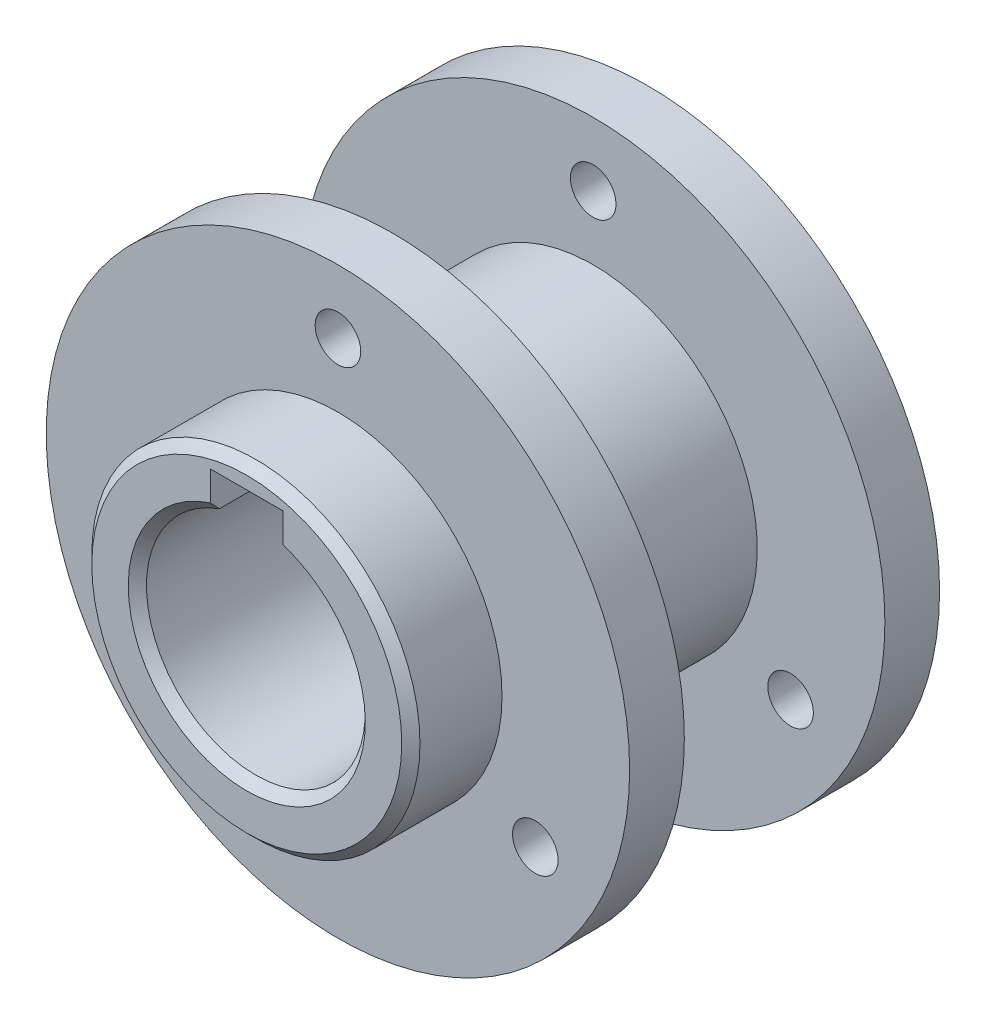
ISO-10303-21;
HEADER;
FILE_DESCRIPTION(('STEP AP214'),'2;1');
FILE_NAME('part.step','',(''),(''),'','','');
FILE_SCHEMA(('AUTOMOTIVE_DESIGN { 1 0 10303 214 1 1 1 1 }'));
ENDSEC;
DATA;
#1=APPLICATION_CONTEXT('core data for automotive mechanical design processes');
#2=APPLICATION_PROTOCOL_DEFINITION('international standard','automotive_design',2000,#1);
#3=PRODUCT_CONTEXT('',#1,'mechanical');
#4=PRODUCT('Part','Part','',(#3));
#5=PRODUCT_RELATED_PRODUCT_CATEGORY('part','',(#4));
#6=PRODUCT_DEFINITION_FORMATION('','',#4);
#7=PRODUCT_DEFINITION_CONTEXT('part definition',#1,'design');
#8=PRODUCT_DEFINITION('design','',#6,#7);
#9=PRODUCT_DEFINITION_SHAPE('','',#8);
#10=(LENGTH_UNIT() NAMED_UNIT(*) SI_UNIT(.MILLI.,.METRE.));
#11=(NAMED_UNIT(*) PLANE_ANGLE_UNIT() SI_UNIT($,.RADIAN.));
#12=(NAMED_UNIT(*) SI_UNIT($,.STERADIAN.) SOLID_ANGLE_UNIT());
#13=UNCERTAINTY_MEASURE_WITH_UNIT(LENGTH_MEASURE(1.E-05),#10,'distance_accuracy_value','');
#14=(GEOMETRIC_REPRESENTATION_CONTEXT(3) GLOBAL_UNCERTAINTY_ASSIGNED_CONTEXT((#13)) GLOBAL_UNIT_ASSIGNED_CONTEXT((#10,
#11,#12)) REPRESENTATION_CONTEXT('',''));
#15=CARTESIAN_POINT('',(0.,0.,0.));
#16=DIRECTION('',(0.,0.,1.));
#17=DIRECTION('',(1.,0.,0.));
#18=AXIS2_PLACEMENT_3D('',#15,#16,#17);
#19=CARTESIAN_POINT('',(0.,0.,-26.9999999999868));
#20=DIRECTION('',(0.,0.,-1.));
#21=DIRECTION('',(-1.,0.,0.));
#22=AXIS2_PLACEMENT_3D('',#19,#20,#21);
#23=CONICAL_SURFACE('',#22,6.50000000001683,0.785398163340605);
#24=CARTESIAN_POINT('',(0.,0.,-26.5));
#25=DIRECTION('',(0.,0.,1.));
#26=DIRECTION('',(1.,0.,0.));
#27=AXIS2_PLACEMENT_3D('',#24,#25,#26);
#28=CIRCLE('',#27,6.);
#29=CARTESIAN_POINT('',(-2.,5.65685424951406,-26.499999999977));
#30=VERTEX_POINT('',#29);
#31=CARTESIAN_POINT('',(2.,5.65685424951222,-26.4999999999753));
#32=VERTEX_POINT('',#31);
#33=EDGE_CURVE('E109',#30,#32,#28,.T.);
#34=ORIENTED_EDGE('',*,*,#33,.T.);
#35=CARTESIAN_POINT('',(2.,5.65685424953206,-26.4999999999506));
#36=CARTESIAN_POINT('',(2.,5.74501185585493,-26.5831325219464));
#37=CARTESIAN_POINT('',(2.,5.83307434371292,-26.6663654517907));
#38=CARTESIAN_POINT('',(2.,6.00900907332968,-26.8330321184897));
#39=CARTESIAN_POINT('',(2.,6.09688131510829,-26.9164658553234));
#40=CARTESIAN_POINT('',(2.,6.18465843844184,-26.9999999999846));
#41=B_SPLINE_CURVE_WITH_KNOTS('',3,(#35,#36,#37,#38,#39,#40),.UNSPECIFIED.,.F.,.F.,(4,2,4),(0.,
0.363516851609109,0.727033665326372),.UNSPECIFIED.);
#42=CARTESIAN_POINT('',(2.,6.18465843844301,-26.9999999999857));
#43=VERTEX_POINT('',#42);
#44=EDGE_CURVE('E197',#32,#43,#41,.T.);
#45=ORIENTED_EDGE('',*,*,#44,.T.);
#46=CARTESIAN_POINT('',(0.,0.,-26.9999999999868));
#47=DIRECTION('',(0.,0.,-1.));
#48=DIRECTION('',(-1.,0.,0.));
#49=AXIS2_PLACEMENT_3D('',#46,#47,#48);
#50=CIRCLE('',#49,6.50000000001683);
#51=CARTESIAN_POINT('',(-2.,6.18465843844301,-26.9999999999857));
#52=VERTEX_POINT('',#51);
#53=EDGE_CURVE('E94',#43,#52,#50,.T.);
#54=ORIENTED_EDGE('',*,*,#53,.T.);
#55=CARTESIAN_POINT('',(-2.,6.18465843844184,-26.9999999999846));
#56=CARTESIAN_POINT('',(-2.,6.0968813151089,-26.916465855324));
#57=CARTESIAN_POINT('',(-2.,6.0090090733309,-26.8330321184908));
#58=CARTESIAN_POINT('',(-2.,5.83307434371536,-26.666365451793));
#59=CARTESIAN_POINT('',(-2.,5.74501185585799,-26.5831325219493));
#60=CARTESIAN_POINT('',(-2.,5.65685424953574,-26.499999999954));
#61=B_SPLINE_CURVE_WITH_KNOTS('',3,(#55,#56,#57,#58,#59,#60),.UNSPECIFIED.,.F.,.F.,(4,2,4),(0.,
0.363516813714742,0.727033665321328),.UNSPECIFIED.);
#62=EDGE_CURVE('E91',#52,#30,#61,.T.);
#63=ORIENTED_EDGE('',*,*,#62,.T.);
#64=EDGE_LOOP('',(#34,#45,#54,#63));
#65=FACE_BOUND('',#64,.T.);
#66=ADVANCED_FACE('F17',(#65),#23,.F.);
#67=CARTESIAN_POINT('',(-2.,4.2,0.));
#68=DIRECTION('',(-1.,0.,0.));
#69=DIRECTION('',(0.,0.,1.));
#70=AXIS2_PLACEMENT_3D('',#67,#68,#69);
#71=PLANE('',#70);
#72=ORIENTED_EDGE('',*,*,#62,.F.);
#73=DIRECTION('',(0.,1.,0.));
#74=VECTOR('',#73,1.);
#75=CARTESIAN_POINT('',(-2.,6.,-27.));
#76=LINE('',#75,#74);
#77=CARTESIAN_POINT('',(-2.,7.8,-27.));
#78=VERTEX_POINT('',#77);
#79=EDGE_CURVE('E83',#52,#78,#76,.T.);
#80=ORIENTED_EDGE('',*,*,#79,.T.);
#81=DIRECTION('',(0.,0.,1.));
#82=VECTOR('',#81,1.);
#83=CARTESIAN_POINT('',(-2.,7.8,0.));
#84=LINE('',#83,#82);
#85=CARTESIAN_POINT('',(-2.,7.8,0.));
#86=VERTEX_POINT('',#85);
#87=EDGE_CURVE('E87',#78,#86,#84,.T.);
#88=ORIENTED_EDGE('',*,*,#87,.T.);
#89=DIRECTION('',(0.,1.,0.));
#90=VECTOR('',#89,1.);
#91=CARTESIAN_POINT('',(-2.,4.2,0.));
#92=LINE('',#91,#90);
#93=CARTESIAN_POINT('',(-2.,6.18465843838212,5.46408833096245E-11));
#94=VERTEX_POINT('',#93);
#95=EDGE_CURVE('E40',#94,#86,#92,.T.);
#96=ORIENTED_EDGE('',*,*,#95,.F.);
#97=CARTESIAN_POINT('',(-2.,5.65685424945765,-0.49999999993588));
#98=CARTESIAN_POINT('',(-2.,5.74501185578258,-0.416867477947635));
#99=CARTESIAN_POINT('',(-2.,5.83307434364262,-0.333634548110986));
#100=CARTESIAN_POINT('',(-2.,6.0090090732635,-0.166967881427282));
#101=CARTESIAN_POINT('',(-2.,6.09688131504418,-0.0835341446011579));
#102=CARTESIAN_POINT('',(-2.,6.1846584383798,5.24380888034014E-11));
#103=B_SPLINE_CURVE_WITH_KNOTS('',3,(#97,#98,#99,#100,#101,#102),.UNSPECIFIED.,.F.,.F.,(4,2,4),
(0.,0.363516851597878,0.727033665303914),.UNSPECIFIED.);
#104=CARTESIAN_POINT('',(-2.,5.65685424947502,-0.499999999933606));
#105=VERTEX_POINT('',#104);
#106=EDGE_CURVE('E21',#105,#94,#103,.T.);
#107=ORIENTED_EDGE('',*,*,#106,.F.);
#108=DIRECTION('',(0.,0.,1.));
#109=VECTOR('',#108,1.);
#110=CARTESIAN_POINT('',(-2.,5.65685424949238,17.5398064383656));
#111=LINE('',#110,#109);
#112=EDGE_CURVE('E93',#105,#30,#111,.F.);
#113=ORIENTED_EDGE('',*,*,#112,.T.);
#114=EDGE_LOOP('',(#72,#80,#88,#96,#107,#113));
#115=FACE_BOUND('',#114,.T.);
#116=ADVANCED_FACE('F85',(#115),#71,.F.);
#117=CARTESIAN_POINT('',(2.,4.2,0.));
#118=DIRECTION('',(1.,0.,0.));
#119=DIRECTION('',(0.,0.,-1.));
#120=AXIS2_PLACEMENT_3D('',#117,#118,#119);
#121=PLANE('',#120);
#122=ORIENTED_EDGE('',*,*,#44,.F.);
#123=DIRECTION('',(0.,0.,1.));
#124=VECTOR('',#123,1.);
#125=CARTESIAN_POINT('',(2.,5.65685424949238,17.5398064383656));
#126=LINE('',#125,#124);
#127=CARTESIAN_POINT('',(2.,5.65685424947307,-0.499999999935438));
#128=VERTEX_POINT('',#127);
#129=EDGE_CURVE('E118',#32,#128,#126,.T.);
#130=ORIENTED_EDGE('',*,*,#129,.T.);
#131=CARTESIAN_POINT('',(2.,6.1846584383798,5.24390346599409E-11));
#132=CARTESIAN_POINT('',(2.,6.09688131504354,-0.0835341446017711));
#133=CARTESIAN_POINT('',(2.,6.00900907326221,-0.166967881428507));
#134=CARTESIAN_POINT('',(2.,5.83307434364003,-0.333634548113434));
#135=CARTESIAN_POINT('',(2.,5.74501185577934,-0.416867477950692));
#136=CARTESIAN_POINT('',(2.,5.65685424945377,-0.499999999939543));
#137=B_SPLINE_CURVE_WITH_KNOTS('',3,(#131,#132,#133,#134,#135,#136),.UNSPECIFIED.,.F.,.F.,(4,2,
4),(0.,0.363516813708706,0.727033665309256),.UNSPECIFIED.);
#138=CARTESIAN_POINT('',(2.,6.18465843835456,2.8421709430404E-11));
#139=VERTEX_POINT('',#138);
#140=EDGE_CURVE('E123',#139,#128,#137,.T.);
#141=ORIENTED_EDGE('',*,*,#140,.F.);
#142=DIRECTION('',(0.,1.,0.));
#143=VECTOR('',#142,1.);
#144=CARTESIAN_POINT('',(2.,4.2,0.));
#145=LINE('',#144,#143);
#146=CARTESIAN_POINT('',(2.,7.8,0.));
#147=VERTEX_POINT('',#146);
#148=EDGE_CURVE('E121',#147,#139,#145,.F.);
#149=ORIENTED_EDGE('',*,*,#148,.F.);
#150=DIRECTION('',(0.,0.,1.));
#151=VECTOR('',#150,1.);
#152=CARTESIAN_POINT('',(2.,7.8,0.));
#153=LINE('',#152,#151);
#154=CARTESIAN_POINT('',(2.,7.8,-27.));
#155=VERTEX_POINT('',#154);
#156=EDGE_CURVE('E76',#147,#155,#153,.F.);
#157=ORIENTED_EDGE('',*,*,#156,.T.);
#158=DIRECTION('',(0.,1.,0.));
#159=VECTOR('',#158,1.);
#160=CARTESIAN_POINT('',(2.,6.,-27.));
#161=LINE('',#160,#159);
#162=EDGE_CURVE('E100',#155,#43,#161,.F.);
#163=ORIENTED_EDGE('',*,*,#162,.T.);
#164=EDGE_LOOP('',(#122,#130,#141,#149,#157,#163));
#165=FACE_BOUND('',#164,.T.);
#166=ADVANCED_FACE('F207',(#165),#121,.F.);
#167=CARTESIAN_POINT('',(0.,6.,-27.));
#168=DIRECTION('',(0.,0.,1.));
#169=DIRECTION('',(1.,0.,0.));
#170=AXIS2_PLACEMENT_3D('',#167,#168,#169);
#171=PLANE('',#170);
#172=ORIENTED_EDGE('',*,*,#53,.F.);
#173=ORIENTED_EDGE('',*,*,#162,.F.);
#174=DIRECTION('',(1.,0.,0.));
#175=VECTOR('',#174,1.);
#176=CARTESIAN_POINT('',(2.,7.8,-27.));
#177=LINE('',#176,#175);
#178=EDGE_CURVE('E97',#155,#78,#177,.F.);
#179=ORIENTED_EDGE('',*,*,#178,.T.);
#180=ORIENTED_EDGE('',*,*,#79,.F.);
#181=EDGE_LOOP('',(#172,#173,#179,#180));
#182=FACE_BOUND('',#181,.T.);
#183=CARTESIAN_POINT('',(0.,0.,-27.));
#184=DIRECTION('',(0.,0.,1.));
#185=DIRECTION('',(1.,0.,0.));
#186=AXIS2_PLACEMENT_3D('',#183,#184,#185);
#187=CIRCLE('',#186,8.5);
#188=CARTESIAN_POINT('',(8.5,0.,-27.));
#189=VERTEX_POINT('',#188);
#190=EDGE_CURVE('E105',#189,#189,#187,.T.);
#191=ORIENTED_EDGE('',*,*,#190,.F.);
#192=EDGE_LOOP('',(#191));
#193=FACE_BOUND('',#192,.T.);
#194=ADVANCED_FACE('F98',(#182,#193),#171,.F.);
#195=CARTESIAN_POINT('',(0.,0.,17.5398064383656));
#196=DIRECTION('',(0.,0.,1.));
#197=DIRECTION('',(1.,0.,0.));
#198=AXIS2_PLACEMENT_3D('',#195,#196,#197);
#199=CYLINDRICAL_SURFACE('',#198,6.);
#200=ORIENTED_EDGE('',*,*,#33,.F.);
#201=ORIENTED_EDGE('',*,*,#112,.F.);
#202=CARTESIAN_POINT('',(0.,0.,-0.499999999931333));
#203=DIRECTION('',(0.,0.,1.));
#204=DIRECTION('',(1.,0.,0.));
#205=AXIS2_PLACEMENT_3D('',#202,#203,#204);
#206=CIRCLE('',#205,5.99999999997181);
#207=EDGE_CURVE('E70',#105,#128,#206,.T.);
#208=ORIENTED_EDGE('',*,*,#207,.T.);
#209=ORIENTED_EDGE('',*,*,#129,.F.);
#210=EDGE_LOOP('',(#200,#201,#208,#209));
#211=FACE_BOUND('',#210,.T.);
#212=ADVANCED_FACE('F237',(#211),#199,.F.);
#213=CARTESIAN_POINT('',(0.,0.,-26.5));
#214=DIRECTION('',(0.,0.,1.));
#215=DIRECTION('',(1.,0.,0.));
#216=AXIS2_PLACEMENT_3D('',#213,#214,#215);
#217=CONICAL_SURFACE('',#216,9.,0.78539816339745);
#218=CARTESIAN_POINT('',(0.,0.,-26.5));
#219=DIRECTION('',(0.,0.,1.));
#220=DIRECTION('',(1.,0.,0.));
#221=AXIS2_PLACEMENT_3D('',#218,#219,#220);
#222=CIRCLE('',#221,9.);
#223=CARTESIAN_POINT('',(9.,0.,-26.5));
#224=VERTEX_POINT('',#223);
#225=EDGE_CURVE('E128',#224,#224,#222,.T.);
#226=ORIENTED_EDGE('',*,*,#225,.F.);
#227=EDGE_LOOP('',(#226));
#228=FACE_BOUND('',#227,.T.);
#229=ORIENTED_EDGE('',*,*,#190,.T.);
#230=EDGE_LOOP('',(#229));
#231=FACE_BOUND('',#230,.T.);
#232=ADVANCED_FACE('F454',(#228,#231),#217,.T.);
#233=CARTESIAN_POINT('',(2.,7.8,0.));
#234=DIRECTION('',(0.,1.,0.));
#235=DIRECTION('',(0.,0.,1.));
#236=AXIS2_PLACEMENT_3D('',#233,#234,#235);
#237=PLANE('',#236);
#238=ORIENTED_EDGE('',*,*,#156,.F.);
#239=DIRECTION('',(-1.,0.,0.));
#240=VECTOR('',#239,1.);
#241=CARTESIAN_POINT('',(0.,7.8,0.));
#242=LINE('',#241,#240);
#243=EDGE_CURVE('E104',#147,#86,#242,.T.);
#244=ORIENTED_EDGE('',*,*,#243,.T.);
#245=ORIENTED_EDGE('',*,*,#87,.F.);
#246=ORIENTED_EDGE('',*,*,#178,.F.);
#247=EDGE_LOOP('',(#238,#244,#245,#246));
#248=FACE_BOUND('',#247,.T.);
#249=ADVANCED_FACE('F103',(#248),#237,.F.);
#250=CARTESIAN_POINT('',(0.,0.,5.6843418860808E-11));
#251=DIRECTION('',(0.,0.,1.));
#252=DIRECTION('',(1.,0.,0.));
#253=AXIS2_PLACEMENT_3D('',#250,#251,#252);
#254=CONICAL_SURFACE('',#253,6.49999999995998,0.785398163397448);
#255=ORIENTED_EDGE('',*,*,#207,.F.);
#256=ORIENTED_EDGE('',*,*,#106,.T.);
#257=CARTESIAN_POINT('',(0.,0.,5.6843418860808E-11));
#258=DIRECTION('',(0.,0.,1.));
#259=DIRECTION('',(1.,0.,0.));
#260=AXIS2_PLACEMENT_3D('',#257,#258,#259);
#261=CIRCLE('',#260,6.49999999995998);
#262=EDGE_CURVE('E127',#94,#139,#261,.T.);
#263=ORIENTED_EDGE('',*,*,#262,.T.);
#264=ORIENTED_EDGE('',*,*,#140,.T.);
#265=EDGE_LOOP('',(#255,#256,#263,#264));
#266=FACE_BOUND('',#265,.T.);
#267=ADVANCED_FACE('F266',(#266),#254,.F.);
#268=CARTESIAN_POINT('',(0.,0.,17.5398064383656));
#269=DIRECTION('',(0.,0.,1.));
#270=DIRECTION('',(1.,0.,0.));
#271=AXIS2_PLACEMENT_3D('',#268,#269,#270);
#272=CYLINDRICAL_SURFACE('',#271,9.);
#273=CARTESIAN_POINT('',(0.,0.,-22.));
#274=DIRECTION('',(0.,0.,1.));
#275=DIRECTION('',(1.,0.,0.));
#276=AXIS2_PLACEMENT_3D('',#273,#274,#275);
#277=CIRCLE('',#276,9.);
#278=CARTESIAN_POINT('',(9.,0.,-22.));
#279=VERTEX_POINT('',#278);
#280=EDGE_CURVE('E191',#279,#279,#277,.F.);
#281=ORIENTED_EDGE('',*,*,#280,.T.);
#282=EDGE_LOOP('',(#281));
#283=FACE_BOUND('',#282,.T.);
#284=ORIENTED_EDGE('',*,*,#225,.T.);
#285=EDGE_LOOP('',(#284));
#286=FACE_BOUND('',#285,.T.);
#287=ADVANCED_FACE('F257',(#283,#286),#272,.T.);
#288=CARTESIAN_POINT('',(0.,9.,0.));
#289=DIRECTION('',(0.,0.,-1.));
#290=DIRECTION('',(-1.,0.,0.));
#291=AXIS2_PLACEMENT_3D('',#288,#289,#290);
#292=PLANE('',#291);
#293=ORIENTED_EDGE('',*,*,#262,.F.);
#294=ORIENTED_EDGE('',*,*,#95,.T.);
#295=ORIENTED_EDGE('',*,*,#243,.F.);
#296=ORIENTED_EDGE('',*,*,#148,.T.);
#297=EDGE_LOOP('',(#293,#294,#295,#296));
#298=FACE_BOUND('',#297,.T.);
#299=CARTESIAN_POINT('',(0.,0.,0.));
#300=DIRECTION('',(0.,0.,-1.));
#301=DIRECTION('',(-1.,0.,0.));
#302=AXIS2_PLACEMENT_3D('',#299,#300,#301);
#303=CIRCLE('',#302,8.50000000000001);
#304=CARTESIAN_POINT('',(-8.50000000000001,0.,0.));
#305=VERTEX_POINT('',#304);
#306=EDGE_CURVE('E188',#305,#305,#303,.T.);
#307=ORIENTED_EDGE('',*,*,#306,.F.);
#308=EDGE_LOOP('',(#307));
#309=FACE_BOUND('',#308,.T.);
#310=ADVANCED_FACE('F255',(#298,#309),#292,.F.);
#311=CARTESIAN_POINT('',(0.,9.,-22.));
#312=DIRECTION('',(0.,0.,1.));
#313=DIRECTION('',(1.,0.,0.));
#314=AXIS2_PLACEMENT_3D('',#311,#312,#313);
#315=PLANE('',#314);
#316=CARTESIAN_POINT('',(-10.8253175473055,-6.25000000000005,-22.));
#317=DIRECTION('',(0.,0.,-1.));
#318=DIRECTION('',(-1.,0.,0.));
#319=AXIS2_PLACEMENT_3D('',#316,#317,#318);
#320=CIRCLE('',#319,1.25);
#321=CARTESIAN_POINT('',(-12.0753175473055,-6.25000000000005,-22.));
#322=VERTEX_POINT('',#321);
#323=EDGE_CURVE('E179',#322,#322,#320,.F.);
#324=ORIENTED_EDGE('',*,*,#323,.T.);
#325=EDGE_LOOP('',(#324));
#326=FACE_BOUND('',#325,.T.);
#327=CARTESIAN_POINT('',(0.,12.5,-22.));
#328=DIRECTION('',(0.,0.,-1.));
#329=DIRECTION('',(-1.,0.,0.));
#330=AXIS2_PLACEMENT_3D('',#327,#328,#329);
#331=CIRCLE('',#330,1.25);
#332=CARTESIAN_POINT('',(-1.25,12.5,-22.));
#333=VERTEX_POINT('',#332);
#334=EDGE_CURVE('E182',#333,#333,#331,.F.);
#335=ORIENTED_EDGE('',*,*,#334,.T.);
#336=EDGE_LOOP('',(#335));
#337=FACE_BOUND('',#336,.T.);
#338=ORIENTED_EDGE('',*,*,#280,.F.);
#339=EDGE_LOOP('',(#338));
#340=FACE_BOUND('',#339,.T.);
#341=CARTESIAN_POINT('',(10.8253175473055,-6.2499999999999,-22.));
#342=DIRECTION('',(0.,0.,-1.));
#343=DIRECTION('',(-1.,0.,0.));
#344=AXIS2_PLACEMENT_3D('',#341,#342,#343);
#345=CIRCLE('',#344,1.25);
#346=CARTESIAN_POINT('',(9.57531754730555,-6.2499999999999,-22.));
#347=VERTEX_POINT('',#346);
#348=EDGE_CURVE('E176',#347,#347,#345,.F.);
#349=ORIENTED_EDGE('',*,*,#348,.T.);
#350=EDGE_LOOP('',(#349));
#351=FACE_BOUND('',#350,.T.);
#352=CARTESIAN_POINT('',(0.,0.,-22.));
#353=DIRECTION('',(0.,0.,1.));
#354=DIRECTION('',(1.,0.,0.));
#355=AXIS2_PLACEMENT_3D('',#352,#353,#354);
#356=CIRCLE('',#355,16.);
#357=CARTESIAN_POINT('',(16.,0.,-22.));
#358=VERTEX_POINT('',#357);
#359=EDGE_CURVE('E185',#358,#358,#356,.T.);
#360=ORIENTED_EDGE('',*,*,#359,.F.);
#361=EDGE_LOOP('',(#360));
#362=FACE_BOUND('',#361,.T.);
#363=ADVANCED_FACE('F251',(#326,#337,#340,#351,#362),#315,.F.);
#364=CARTESIAN_POINT('',(0.,0.,-0.499999999999992));
#365=DIRECTION('',(0.,0.,-1.));
#366=DIRECTION('',(-1.,0.,0.));
#367=AXIS2_PLACEMENT_3D('',#364,#365,#366);
#368=CONICAL_SURFACE('',#367,9.,0.785398163397445);
#369=CARTESIAN_POINT('',(0.,0.,-0.49999999999999));
#370=DIRECTION('',(0.,0.,1.));
#371=DIRECTION('',(1.,0.,0.));
#372=AXIS2_PLACEMENT_3D('',#369,#370,#371);
#373=CIRCLE('',#372,9.);
#374=CARTESIAN_POINT('',(9.,0.,-0.49999999999999));
#375=VERTEX_POINT('',#374);
#376=EDGE_CURVE('E175',#375,#375,#373,.F.);
#377=ORIENTED_EDGE('',*,*,#376,.F.);
#378=EDGE_LOOP('',(#377));
#379=FACE_BOUND('',#378,.T.);
#380=ORIENTED_EDGE('',*,*,#306,.T.);
#381=EDGE_LOOP('',(#380));
#382=FACE_BOUND('',#381,.T.);
#383=ADVANCED_FACE('F247',(#379,#382),#368,.T.);
#384=CARTESIAN_POINT('',(0.,0.,17.5398064383656));
#385=DIRECTION('',(0.,0.,1.));
#386=DIRECTION('',(1.,0.,0.));
#387=AXIS2_PLACEMENT_3D('',#384,#385,#386);
#388=CYLINDRICAL_SURFACE('',#387,16.);
#389=ORIENTED_EDGE('',*,*,#359,.T.);
#390=EDGE_LOOP('',(#389));
#391=FACE_BOUND('',#390,.T.);
#392=CARTESIAN_POINT('',(0.,0.,-19.));
#393=DIRECTION('',(0.,0.,1.));
#394=DIRECTION('',(1.,0.,0.));
#395=AXIS2_PLACEMENT_3D('',#392,#393,#394);
#396=CIRCLE('',#395,16.);
#397=CARTESIAN_POINT('',(16.,0.,-19.));
#398=VERTEX_POINT('',#397);
#399=EDGE_CURVE('E172',#398,#398,#396,.T.);
#400=ORIENTED_EDGE('',*,*,#399,.F.);
#401=EDGE_LOOP('',(#400));
#402=FACE_BOUND('',#401,.T.);
#403=ADVANCED_FACE('F250',(#391,#402),#388,.T.);
#404=CARTESIAN_POINT('',(0.,12.5,-22.));
#405=DIRECTION('',(0.,0.,-1.));
#406=DIRECTION('',(-1.,0.,0.));
#407=AXIS2_PLACEMENT_3D('',#404,#405,#406);
#408=CYLINDRICAL_SURFACE('',#407,1.25);
#409=ORIENTED_EDGE('',*,*,#334,.F.);
#410=EDGE_LOOP('',(#409));
#411=FACE_BOUND('',#410,.T.);
#412=CARTESIAN_POINT('',(0.,12.5,-19.));
#413=DIRECTION('',(0.,0.,-1.));
#414=DIRECTION('',(-1.,0.,0.));
#415=AXIS2_PLACEMENT_3D('',#412,#413,#414);
#416=CIRCLE('',#415,1.25);
#417=CARTESIAN_POINT('',(-1.25,12.5,-19.));
#418=VERTEX_POINT('',#417);
#419=EDGE_CURVE('E169',#418,#418,#416,.T.);
#420=ORIENTED_EDGE('',*,*,#419,.F.);
#421=EDGE_LOOP('',(#420));
#422=FACE_BOUND('',#421,.T.);
#423=ADVANCED_FACE('F314',(#411,#422),#408,.F.);
#424=CARTESIAN_POINT('',(-10.8253175473055,-6.25000000000005,-22.));
#425=DIRECTION('',(0.,0.,-1.));
#426=DIRECTION('',(-1.,0.,0.));
#427=AXIS2_PLACEMENT_3D('',#424,#425,#426);
#428=CYLINDRICAL_SURFACE('',#427,1.25);
#429=ORIENTED_EDGE('',*,*,#323,.F.);
#430=EDGE_LOOP('',(#429));
#431=FACE_BOUND('',#430,.T.);
#432=CARTESIAN_POINT('',(-10.8253175473055,-6.25000000000005,-19.));
#433=DIRECTION('',(0.,0.,-1.));
#434=DIRECTION('',(-1.,0.,0.));
#435=AXIS2_PLACEMENT_3D('',#432,#433,#434);
#436=CIRCLE('',#435,1.25);
#437=CARTESIAN_POINT('',(-12.0753175473055,-6.25000000000005,-19.));
#438=VERTEX_POINT('',#437);
#439=EDGE_CURVE('E166',#438,#438,#436,.T.);
#440=ORIENTED_EDGE('',*,*,#439,.F.);
#441=EDGE_LOOP('',(#440));
#442=FACE_BOUND('',#441,.T.);
#443=ADVANCED_FACE('F310',(#431,#442),#428,.F.);
#444=CARTESIAN_POINT('',(10.8253175473055,-6.2499999999999,-22.));
#445=DIRECTION('',(0.,0.,-1.));
#446=DIRECTION('',(-1.,0.,0.));
#447=AXIS2_PLACEMENT_3D('',#444,#445,#446);
#448=CYLINDRICAL_SURFACE('',#447,1.25);
#449=ORIENTED_EDGE('',*,*,#348,.F.);
#450=EDGE_LOOP('',(#449));
#451=FACE_BOUND('',#450,.T.);
#452=CARTESIAN_POINT('',(10.8253175473055,-6.2499999999999,-19.));
#453=DIRECTION('',(0.,0.,-1.));
#454=DIRECTION('',(-1.,0.,0.));
#455=AXIS2_PLACEMENT_3D('',#452,#453,#454);
#456=CIRCLE('',#455,1.25);
#457=CARTESIAN_POINT('',(9.57531754730555,-6.2499999999999,-19.));
#458=VERTEX_POINT('',#457);
#459=EDGE_CURVE('E163',#458,#458,#456,.T.);
#460=ORIENTED_EDGE('',*,*,#459,.F.);
#461=EDGE_LOOP('',(#460));
#462=FACE_BOUND('',#461,.T.);
#463=ADVANCED_FACE('F307',(#451,#462),#448,.F.);
#464=CARTESIAN_POINT('',(0.,0.,17.5398064383656));
#465=DIRECTION('',(0.,0.,1.));
#466=DIRECTION('',(1.,0.,0.));
#467=AXIS2_PLACEMENT_3D('',#464,#465,#466);
#468=CYLINDRICAL_SURFACE('',#467,9.);
#469=ORIENTED_EDGE('',*,*,#376,.T.);
#470=EDGE_LOOP('',(#469));
#471=FACE_BOUND('',#470,.T.);
#472=CARTESIAN_POINT('',(0.,0.,-5.));
#473=DIRECTION('',(0.,0.,1.));
#474=DIRECTION('',(1.,0.,0.));
#475=AXIS2_PLACEMENT_3D('',#472,#473,#474);
#476=CIRCLE('',#475,9.);
#477=CARTESIAN_POINT('',(9.,0.,-5.));
#478=VERTEX_POINT('',#477);
#479=EDGE_CURVE('E160',#478,#478,#476,.T.);
#480=ORIENTED_EDGE('',*,*,#479,.T.);
#481=EDGE_LOOP('',(#480));
#482=FACE_BOUND('',#481,.T.);
#483=ADVANCED_FACE('F244',(#471,#482),#468,.T.);
#484=CARTESIAN_POINT('',(9.,0.,-19.));
#485=DIRECTION('',(0.,0.,1.));
#486=DIRECTION('',(1.,0.,0.));
#487=AXIS2_PLACEMENT_3D('',#484,#485,#486);
#488=PLANE('',#487);
#489=ORIENTED_EDGE('',*,*,#459,.T.);
#490=EDGE_LOOP('',(#489));
#491=FACE_BOUND('',#490,.T.);
#492=ORIENTED_EDGE('',*,*,#439,.T.);
#493=EDGE_LOOP('',(#492));
#494=FACE_BOUND('',#493,.T.);
#495=ORIENTED_EDGE('',*,*,#419,.T.);
#496=EDGE_LOOP('',(#495));
#497=FACE_BOUND('',#496,.T.);
#498=CARTESIAN_POINT('',(0.,0.,-19.));
#499=DIRECTION('',(0.,0.,-1.));
#500=DIRECTION('',(-1.,0.,0.));
#501=AXIS2_PLACEMENT_3D('',#498,#499,#500);
#502=CIRCLE('',#501,9.);
#503=CARTESIAN_POINT('',(-9.,0.,-19.));
#504=VERTEX_POINT('',#503);
#505=EDGE_CURVE('E157',#504,#504,#502,.F.);
#506=ORIENTED_EDGE('',*,*,#505,.F.);
#507=EDGE_LOOP('',(#506));
#508=FACE_BOUND('',#507,.T.);
#509=ORIENTED_EDGE('',*,*,#399,.T.);
#510=EDGE_LOOP('',(#509));
#511=FACE_BOUND('',#510,.T.);
#512=ADVANCED_FACE('F300',(#491,#494,#497,#508,#511),#488,.T.);
#513=CARTESIAN_POINT('',(0.,16.,-5.));
#514=DIRECTION('',(0.,0.,-1.));
#515=DIRECTION('',(-1.,0.,0.));
#516=AXIS2_PLACEMENT_3D('',#513,#514,#515);
#517=PLANE('',#516);
#518=CARTESIAN_POINT('',(0.,12.5,-5.));
#519=DIRECTION('',(0.,0.,-1.));
#520=DIRECTION('',(-1.,0.,0.));
#521=AXIS2_PLACEMENT_3D('',#518,#519,#520);
#522=CIRCLE('',#521,1.25);
#523=CARTESIAN_POINT('',(-1.25,12.5,-5.));
#524=VERTEX_POINT('',#523);
#525=EDGE_CURVE('E151',#524,#524,#522,.T.);
#526=ORIENTED_EDGE('',*,*,#525,.T.);
#527=EDGE_LOOP('',(#526));
#528=FACE_BOUND('',#527,.T.);
#529=CARTESIAN_POINT('',(10.8253175473055,-6.2499999999999,-5.));
#530=DIRECTION('',(0.,0.,-1.));
#531=DIRECTION('',(-1.,0.,0.));
#532=AXIS2_PLACEMENT_3D('',#529,#530,#531);
#533=CIRCLE('',#532,1.25);
#534=CARTESIAN_POINT('',(9.57531754730555,-6.2499999999999,-5.));
#535=VERTEX_POINT('',#534);
#536=EDGE_CURVE('E148',#535,#535,#533,.T.);
#537=ORIENTED_EDGE('',*,*,#536,.T.);
#538=EDGE_LOOP('',(#537));
#539=FACE_BOUND('',#538,.T.);
#540=ORIENTED_EDGE('',*,*,#479,.F.);
#541=EDGE_LOOP('',(#540));
#542=FACE_BOUND('',#541,.T.);
#543=CARTESIAN_POINT('',(-10.8253175473055,-6.25000000000005,-5.));
#544=DIRECTION('',(0.,0.,-1.));
#545=DIRECTION('',(-1.,0.,0.));
#546=AXIS2_PLACEMENT_3D('',#543,#544,#545);
#547=CIRCLE('',#546,1.25);
#548=CARTESIAN_POINT('',(-12.0753175473055,-6.25000000000005,-5.));
#549=VERTEX_POINT('',#548);
#550=EDGE_CURVE('E145',#549,#549,#547,.T.);
#551=ORIENTED_EDGE('',*,*,#550,.T.);
#552=EDGE_LOOP('',(#551));
#553=FACE_BOUND('',#552,.T.);
#554=CARTESIAN_POINT('',(0.,0.,-5.));
#555=DIRECTION('',(0.,0.,1.));
#556=DIRECTION('',(1.,0.,0.));
#557=AXIS2_PLACEMENT_3D('',#554,#555,#556);
#558=CIRCLE('',#557,16.);
#559=CARTESIAN_POINT('',(16.,0.,-5.));
#560=VERTEX_POINT('',#559);
#561=EDGE_CURVE('E154',#560,#560,#558,.F.);
#562=ORIENTED_EDGE('',*,*,#561,.F.);
#563=EDGE_LOOP('',(#562));
#564=FACE_BOUND('',#563,.T.);
#565=ADVANCED_FACE('F296',(#528,#539,#542,#553,#564),#517,.F.);
#566=CARTESIAN_POINT('',(0.,0.,-23.891301569637));
#567=DIRECTION('',(0.,0.,-1.));
#568=DIRECTION('',(-1.,0.,0.));
#569=AXIS2_PLACEMENT_3D('',#566,#567,#568);
#570=CYLINDRICAL_SURFACE('',#569,9.);
#571=CARTESIAN_POINT('',(0.,0.,-8.));
#572=DIRECTION('',(0.,0.,-1.));
#573=DIRECTION('',(-1.,0.,0.));
#574=AXIS2_PLACEMENT_3D('',#571,#572,#573);
#575=CIRCLE('',#574,9.);
#576=CARTESIAN_POINT('',(-9.,0.,-8.));
#577=VERTEX_POINT('',#576);
#578=EDGE_CURVE('E142',#577,#577,#575,.F.);
#579=ORIENTED_EDGE('',*,*,#578,.F.);
#580=EDGE_LOOP('',(#579));
#581=FACE_BOUND('',#580,.T.);
#582=ORIENTED_EDGE('',*,*,#505,.T.);
#583=EDGE_LOOP('',(#582));
#584=FACE_BOUND('',#583,.T.);
#585=ADVANCED_FACE('F292',(#581,#584),#570,.T.);
#586=CARTESIAN_POINT('',(0.,0.,17.5398064383656));
#587=DIRECTION('',(0.,0.,1.));
#588=DIRECTION('',(1.,0.,0.));
#589=AXIS2_PLACEMENT_3D('',#586,#587,#588);
#590=CYLINDRICAL_SURFACE('',#589,16.);
#591=ORIENTED_EDGE('',*,*,#561,.T.);
#592=EDGE_LOOP('',(#591));
#593=FACE_BOUND('',#592,.T.);
#594=CARTESIAN_POINT('',(0.,0.,-8.));
#595=DIRECTION('',(0.,0.,1.));
#596=DIRECTION('',(1.,0.,0.));
#597=AXIS2_PLACEMENT_3D('',#594,#595,#596);
#598=CIRCLE('',#597,16.);
#599=CARTESIAN_POINT('',(16.,0.,-8.));
#600=VERTEX_POINT('',#599);
#601=EDGE_CURVE('E139',#600,#600,#598,.F.);
#602=ORIENTED_EDGE('',*,*,#601,.F.);
#603=EDGE_LOOP('',(#602));
#604=FACE_BOUND('',#603,.T.);
#605=ADVANCED_FACE('F288',(#593,#604),#590,.T.);
#606=CARTESIAN_POINT('',(0.,12.5,-22.));
#607=DIRECTION('',(0.,0.,-1.));
#608=DIRECTION('',(-1.,0.,0.));
#609=AXIS2_PLACEMENT_3D('',#606,#607,#608);
#610=CYLINDRICAL_SURFACE('',#609,1.25);
#611=ORIENTED_EDGE('',*,*,#525,.F.);
#612=EDGE_LOOP('',(#611));
#613=FACE_BOUND('',#612,.T.);
#614=CARTESIAN_POINT('',(0.,12.5,-8.));
#615=DIRECTION('',(0.,0.,-1.));
#616=DIRECTION('',(-1.,0.,0.));
#617=AXIS2_PLACEMENT_3D('',#614,#615,#616);
#618=CIRCLE('',#617,1.25);
#619=CARTESIAN_POINT('',(-1.25,12.5,-8.));
#620=VERTEX_POINT('',#619);
#621=EDGE_CURVE('E136',#620,#620,#618,.F.);
#622=ORIENTED_EDGE('',*,*,#621,.F.);
#623=EDGE_LOOP('',(#622));
#624=FACE_BOUND('',#623,.T.);
#625=ADVANCED_FACE('F284',(#613,#624),#610,.F.);
#626=CARTESIAN_POINT('',(10.8253175473055,-6.2499999999999,-22.));
#627=DIRECTION('',(0.,0.,-1.));
#628=DIRECTION('',(-1.,0.,0.));
#629=AXIS2_PLACEMENT_3D('',#626,#627,#628);
#630=CYLINDRICAL_SURFACE('',#629,1.25);
#631=ORIENTED_EDGE('',*,*,#536,.F.);
#632=EDGE_LOOP('',(#631));
#633=FACE_BOUND('',#632,.T.);
#634=CARTESIAN_POINT('',(10.8253175473055,-6.2499999999999,-8.));
#635=DIRECTION('',(0.,0.,-1.));
#636=DIRECTION('',(-1.,0.,0.));
#637=AXIS2_PLACEMENT_3D('',#634,#635,#636);
#638=CIRCLE('',#637,1.25);
#639=CARTESIAN_POINT('',(9.57531754730555,-6.2499999999999,-8.));
#640=VERTEX_POINT('',#639);
#641=EDGE_CURVE('E31',#640,#640,#638,.F.);
#642=ORIENTED_EDGE('',*,*,#641,.F.);
#643=EDGE_LOOP('',(#642));
#644=FACE_BOUND('',#643,.T.);
#645=ADVANCED_FACE('F277',(#633,#644),#630,.F.);
#646=CARTESIAN_POINT('',(-10.8253175473055,-6.25000000000005,-22.));
#647=DIRECTION('',(0.,0.,-1.));
#648=DIRECTION('',(-1.,0.,0.));
#649=AXIS2_PLACEMENT_3D('',#646,#647,#648);
#650=CYLINDRICAL_SURFACE('',#649,1.25);
#651=ORIENTED_EDGE('',*,*,#550,.F.);
#652=EDGE_LOOP('',(#651));
#653=FACE_BOUND('',#652,.T.);
#654=CARTESIAN_POINT('',(-10.8253175473055,-6.25000000000005,-8.));
#655=DIRECTION('',(0.,0.,-1.));
#656=DIRECTION('',(-1.,0.,0.));
#657=AXIS2_PLACEMENT_3D('',#654,#655,#656);
#658=CIRCLE('',#657,1.25);
#659=CARTESIAN_POINT('',(-12.0753175473055,-6.25000000000005,-8.));
#660=VERTEX_POINT('',#659);
#661=EDGE_CURVE('E10',#660,#660,#658,.F.);
#662=ORIENTED_EDGE('',*,*,#661,.F.);
#663=EDGE_LOOP('',(#662));
#664=FACE_BOUND('',#663,.T.);
#665=ADVANCED_FACE('F271',(#653,#664),#650,.F.);
#666=CARTESIAN_POINT('',(9.,0.,-8.));
#667=DIRECTION('',(0.,0.,-1.));
#668=DIRECTION('',(-1.,0.,0.));
#669=AXIS2_PLACEMENT_3D('',#666,#667,#668);
#670=PLANE('',#669);
#671=ORIENTED_EDGE('',*,*,#661,.T.);
#672=EDGE_LOOP('',(#671));
#673=FACE_BOUND('',#672,.T.);
#674=ORIENTED_EDGE('',*,*,#641,.T.);
#675=EDGE_LOOP('',(#674));
#676=FACE_BOUND('',#675,.T.);
#677=ORIENTED_EDGE('',*,*,#621,.T.);
#678=EDGE_LOOP('',(#677));
#679=FACE_BOUND('',#678,.T.);
#680=ORIENTED_EDGE('',*,*,#601,.T.);
#681=EDGE_LOOP('',(#680));
#682=FACE_BOUND('',#681,.T.);
#683=ORIENTED_EDGE('',*,*,#578,.T.);
#684=EDGE_LOOP('',(#683));
#685=FACE_BOUND('',#684,.T.);
#686=ADVANCED_FACE('F269',(#673,#676,#679,#682,#685),#670,.T.);
#687=CLOSED_SHELL('',(#66,#116,#166,#194,#212,#232,#249,#267,#287,#310,#363,#383,#403,#423,#443,
#463,#483,#512,#565,#585,#605,#625,#645,#665,#686));
#688=MANIFOLD_SOLID_BREP('B1',#687);
#689=ADVANCED_BREP_SHAPE_REPRESENTATION('',(#18,#688),#14);
#690=SHAPE_DEFINITION_REPRESENTATION(#9,#689);
ENDSEC;
END-ISO-10303-21;
